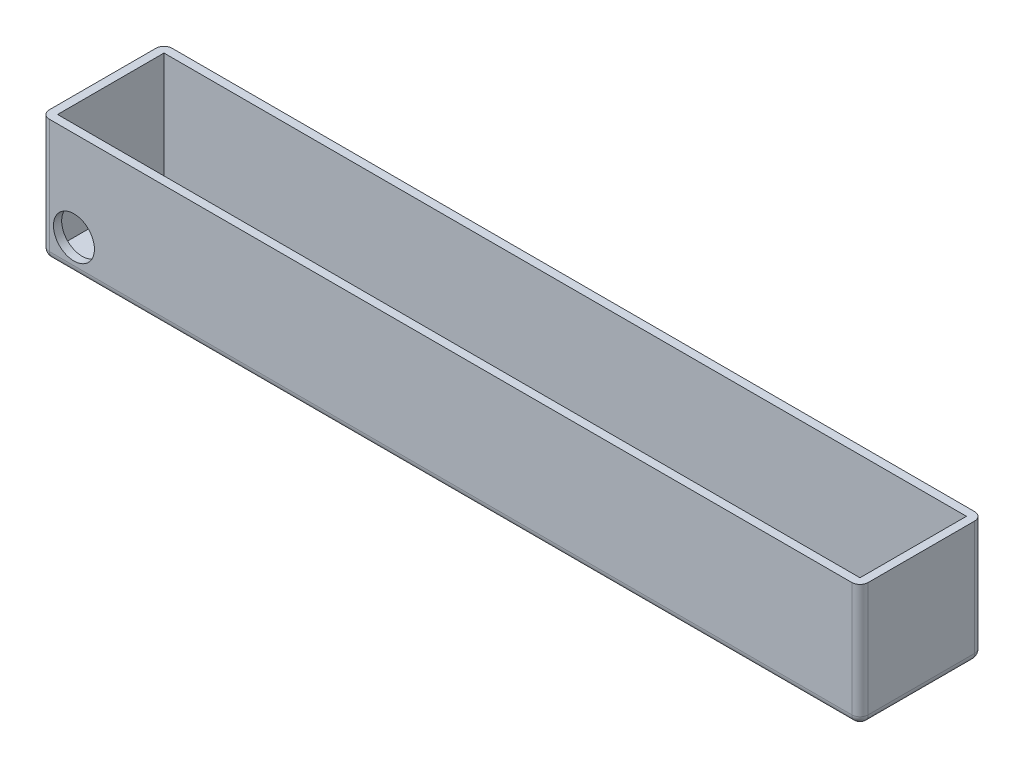
ISO-10303-21;
HEADER;
FILE_DESCRIPTION(('STEP AP214'),'2;1');
FILE_NAME('part.step','',(''),(''),'','','');
FILE_SCHEMA(('AUTOMOTIVE_DESIGN { 1 0 10303 214 1 1 1 1 }'));
ENDSEC;
DATA;
#1=APPLICATION_CONTEXT('core data for automotive mechanical design processes');
#2=APPLICATION_PROTOCOL_DEFINITION('international standard','automotive_design',2000,#1);
#3=PRODUCT_CONTEXT('',#1,'mechanical');
#4=PRODUCT('Part','Part','',(#3));
#5=PRODUCT_RELATED_PRODUCT_CATEGORY('part','',(#4));
#6=PRODUCT_DEFINITION_FORMATION('','',#4);
#7=PRODUCT_DEFINITION_CONTEXT('part definition',#1,'design');
#8=PRODUCT_DEFINITION('design','',#6,#7);
#9=PRODUCT_DEFINITION_SHAPE('','',#8);
#10=(LENGTH_UNIT() NAMED_UNIT(*) SI_UNIT(.MILLI.,.METRE.));
#11=(NAMED_UNIT(*) PLANE_ANGLE_UNIT() SI_UNIT($,.RADIAN.));
#12=(NAMED_UNIT(*) SI_UNIT($,.STERADIAN.) SOLID_ANGLE_UNIT());
#13=UNCERTAINTY_MEASURE_WITH_UNIT(LENGTH_MEASURE(1.E-05),#10,'distance_accuracy_value','');
#14=(GEOMETRIC_REPRESENTATION_CONTEXT(3) GLOBAL_UNCERTAINTY_ASSIGNED_CONTEXT((#13)) GLOBAL_UNIT_ASSIGNED_CONTEXT((#10,
#11,#12)) REPRESENTATION_CONTEXT('',''));
#15=CARTESIAN_POINT('',(0.,0.,0.));
#16=DIRECTION('',(0.,0.,1.));
#17=DIRECTION('',(1.,0.,0.));
#18=AXIS2_PLACEMENT_3D('',#15,#16,#17);
#19=CARTESIAN_POINT('',(124.46,0.,19.05));
#20=DIRECTION('',(0.,0.,-1.));
#21=DIRECTION('',(-1.,0.,0.));
#22=AXIS2_PLACEMENT_3D('',#19,#20,#21);
#23=PLANE('',#22);
#24=CARTESIAN_POINT('',(-116.84,10.16,19.05));
#25=DIRECTION('',(0.,0.,-1.));
#26=DIRECTION('',(-1.,0.,0.));
#27=AXIS2_PLACEMENT_3D('',#24,#25,#26);
#28=CIRCLE('',#27,6.35);
#29=CARTESIAN_POINT('',(-110.49,10.16,19.05));
#30=VERTEX_POINT('',#29);
#31=EDGE_CURVE('E310',#30,#30,#28,.T.);
#32=ORIENTED_EDGE('',*,*,#31,.T.);
#33=EDGE_LOOP('',(#32));
#34=FACE_BOUND('',#33,.T.);
#35=DIRECTION('',(-1.,0.,0.));
#36=VECTOR('',#35,1.);
#37=CARTESIAN_POINT('',(124.46,2.54,19.05));
#38=LINE('',#37,#36);
#39=CARTESIAN_POINT('',(124.46,2.54,19.05));
#40=VERTEX_POINT('',#39);
#41=CARTESIAN_POINT('',(-124.46,2.54,19.05));
#42=VERTEX_POINT('',#41);
#43=EDGE_CURVE('E254',#40,#42,#38,.T.);
#44=ORIENTED_EDGE('',*,*,#43,.F.);
#45=DIRECTION('',(0.,1.,0.));
#46=VECTOR('',#45,1.);
#47=CARTESIAN_POINT('',(124.46,38.1,19.05));
#48=LINE('',#47,#46);
#49=CARTESIAN_POINT('',(124.46,38.1,19.05));
#50=VERTEX_POINT('',#49);
#51=EDGE_CURVE('E332',#40,#50,#48,.T.);
#52=ORIENTED_EDGE('',*,*,#51,.T.);
#53=DIRECTION('',(-1.,0.,0.));
#54=VECTOR('',#53,1.);
#55=CARTESIAN_POINT('',(124.46,38.1,19.05));
#56=LINE('',#55,#54);
#57=CARTESIAN_POINT('',(-124.46,38.1,19.05));
#58=VERTEX_POINT('',#57);
#59=EDGE_CURVE('E197',#50,#58,#56,.T.);
#60=ORIENTED_EDGE('',*,*,#59,.T.);
#61=DIRECTION('',(0.,-1.,0.));
#62=VECTOR('',#61,1.);
#63=CARTESIAN_POINT('',(-124.46,0.,19.05));
#64=LINE('',#63,#62);
#65=EDGE_CURVE('E257',#58,#42,#64,.T.);
#66=ORIENTED_EDGE('',*,*,#65,.T.);
#67=EDGE_LOOP('',(#44,#52,#60,#66));
#68=FACE_BOUND('',#67,.T.);
#69=ADVANCED_FACE('F45',(#34,#68),#23,.F.);
#70=CARTESIAN_POINT('',(124.46,2.54,16.51));
#71=DIRECTION('',(-1.,0.,0.));
#72=DIRECTION('',(0.,0.,1.));
#73=AXIS2_PLACEMENT_3D('',#70,#71,#72);
#74=CYLINDRICAL_SURFACE('',#73,2.54);
#75=DIRECTION('',(-1.,0.,0.));
#76=VECTOR('',#75,1.);
#77=CARTESIAN_POINT('',(124.46,0.,16.51));
#78=LINE('',#77,#76);
#79=CARTESIAN_POINT('',(124.46,0.,16.51));
#80=VERTEX_POINT('',#79);
#81=CARTESIAN_POINT('',(-124.46,0.,16.51));
#82=VERTEX_POINT('',#81);
#83=EDGE_CURVE('E251',#80,#82,#78,.T.);
#84=ORIENTED_EDGE('',*,*,#83,.F.);
#85=CARTESIAN_POINT('',(124.46,2.54,16.51));
#86=DIRECTION('',(-1.,0.,0.));
#87=DIRECTION('',(0.,0.,1.));
#88=AXIS2_PLACEMENT_3D('',#85,#86,#87);
#89=CIRCLE('',#88,2.54);
#90=EDGE_CURVE('E55',#80,#40,#89,.T.);
#91=ORIENTED_EDGE('',*,*,#90,.T.);
#92=ORIENTED_EDGE('',*,*,#43,.T.);
#93=CARTESIAN_POINT('',(-124.46,2.54,16.51));
#94=DIRECTION('',(-1.,0.,0.));
#95=DIRECTION('',(0.,0.,1.));
#96=AXIS2_PLACEMENT_3D('',#93,#94,#95);
#97=CIRCLE('',#96,2.54);
#98=EDGE_CURVE('E277',#42,#82,#97,.F.);
#99=ORIENTED_EDGE('',*,*,#98,.T.);
#100=EDGE_LOOP('',(#84,#91,#92,#99));
#101=FACE_BOUND('',#100,.T.);
#102=ADVANCED_FACE('F376',(#101),#74,.T.);
#103=CARTESIAN_POINT('',(124.46,0.,0.));
#104=DIRECTION('',(0.,1.,0.));
#105=DIRECTION('',(0.,0.,1.));
#106=AXIS2_PLACEMENT_3D('',#103,#104,#105);
#107=PLANE('',#106);
#108=DIRECTION('',(-1.,0.,0.));
#109=VECTOR('',#108,1.);
#110=CARTESIAN_POINT('',(124.46,0.,-16.51));
#111=LINE('',#110,#109);
#112=CARTESIAN_POINT('',(124.46,0.,-16.51));
#113=VERTEX_POINT('',#112);
#114=CARTESIAN_POINT('',(-124.46,0.,-16.51));
#115=VERTEX_POINT('',#114);
#116=EDGE_CURVE('E248',#113,#115,#111,.T.);
#117=ORIENTED_EDGE('',*,*,#116,.F.);
#118=DIRECTION('',(0.,0.,1.));
#119=VECTOR('',#118,1.);
#120=CARTESIAN_POINT('',(124.46,0.,16.51));
#121=LINE('',#120,#119);
#122=EDGE_CURVE('E11',#113,#80,#121,.T.);
#123=ORIENTED_EDGE('',*,*,#122,.T.);
#124=ORIENTED_EDGE('',*,*,#83,.T.);
#125=DIRECTION('',(0.,0.,-1.));
#126=VECTOR('',#125,1.);
#127=CARTESIAN_POINT('',(-124.46,0.,0.));
#128=LINE('',#127,#126);
#129=EDGE_CURVE('E289',#82,#115,#128,.T.);
#130=ORIENTED_EDGE('',*,*,#129,.T.);
#131=EDGE_LOOP('',(#117,#123,#124,#130));
#132=FACE_BOUND('',#131,.T.);
#133=ADVANCED_FACE('F382',(#132),#107,.F.);
#134=CARTESIAN_POINT('',(124.46,2.54,-16.51));
#135=DIRECTION('',(-1.,0.,0.));
#136=DIRECTION('',(0.,0.,1.));
#137=AXIS2_PLACEMENT_3D('',#134,#135,#136);
#138=CYLINDRICAL_SURFACE('',#137,2.54);
#139=DIRECTION('',(-1.,0.,0.));
#140=VECTOR('',#139,1.);
#141=CARTESIAN_POINT('',(124.46,2.54,-19.05));
#142=LINE('',#141,#140);
#143=CARTESIAN_POINT('',(124.46,2.54,-19.05));
#144=VERTEX_POINT('',#143);
#145=CARTESIAN_POINT('',(-124.46,2.54,-19.05));
#146=VERTEX_POINT('',#145);
#147=EDGE_CURVE('E245',#144,#146,#142,.T.);
#148=ORIENTED_EDGE('',*,*,#147,.F.);
#149=CARTESIAN_POINT('',(124.46,2.54,-16.51));
#150=DIRECTION('',(-1.,0.,0.));
#151=DIRECTION('',(0.,0.,1.));
#152=AXIS2_PLACEMENT_3D('',#149,#150,#151);
#153=CIRCLE('',#152,2.54);
#154=EDGE_CURVE('E329',#144,#113,#153,.T.);
#155=ORIENTED_EDGE('',*,*,#154,.T.);
#156=ORIENTED_EDGE('',*,*,#116,.T.);
#157=CARTESIAN_POINT('',(-124.46,2.54,-16.51));
#158=DIRECTION('',(-1.,0.,0.));
#159=DIRECTION('',(0.,0.,1.));
#160=AXIS2_PLACEMENT_3D('',#157,#158,#159);
#161=CIRCLE('',#160,2.54);
#162=EDGE_CURVE('E285',#115,#146,#161,.F.);
#163=ORIENTED_EDGE('',*,*,#162,.T.);
#164=EDGE_LOOP('',(#148,#155,#156,#163));
#165=FACE_BOUND('',#164,.T.);
#166=ADVANCED_FACE('F389',(#165),#138,.T.);
#167=CARTESIAN_POINT('',(124.46,0.,-19.05));
#168=DIRECTION('',(0.,0.,-1.));
#169=DIRECTION('',(0.,1.,0.));
#170=AXIS2_PLACEMENT_3D('',#167,#168,#169);
#171=PLANE('',#170);
#172=DIRECTION('',(-1.,0.,0.));
#173=VECTOR('',#172,1.);
#174=CARTESIAN_POINT('',(124.46,38.1,-19.05));
#175=LINE('',#174,#173);
#176=CARTESIAN_POINT('',(124.46,38.1,-19.05));
#177=VERTEX_POINT('',#176);
#178=CARTESIAN_POINT('',(-124.46,38.1,-19.05));
#179=VERTEX_POINT('',#178);
#180=EDGE_CURVE('E242',#177,#179,#175,.T.);
#181=ORIENTED_EDGE('',*,*,#180,.F.);
#182=DIRECTION('',(0.,1.,0.));
#183=VECTOR('',#182,1.);
#184=CARTESIAN_POINT('',(124.46,0.,-19.05));
#185=LINE('',#184,#183);
#186=EDGE_CURVE('E326',#177,#144,#185,.F.);
#187=ORIENTED_EDGE('',*,*,#186,.T.);
#188=ORIENTED_EDGE('',*,*,#147,.T.);
#189=DIRECTION('',(0.,-1.,0.));
#190=VECTOR('',#189,1.);
#191=CARTESIAN_POINT('',(-124.46,38.1,-19.05));
#192=LINE('',#191,#190);
#193=EDGE_CURVE('E281',#146,#179,#192,.F.);
#194=ORIENTED_EDGE('',*,*,#193,.T.);
#195=EDGE_LOOP('',(#181,#187,#188,#194));
#196=FACE_BOUND('',#195,.T.);
#197=ADVANCED_FACE('F397',(#196),#171,.T.);
#198=CARTESIAN_POINT('',(124.46,0.,-16.51));
#199=DIRECTION('',(0.,0.,-1.));
#200=DIRECTION('',(0.,1.,0.));
#201=AXIS2_PLACEMENT_3D('',#198,#199,#200);
#202=PLANE('',#201);
#203=DIRECTION('',(0.,-1.,0.));
#204=VECTOR('',#203,1.);
#205=CARTESIAN_POINT('',(-124.46,0.,-16.51));
#206=LINE('',#205,#204);
#207=CARTESIAN_POINT('',(-124.46,38.1,-16.51));
#208=VERTEX_POINT('',#207);
#209=CARTESIAN_POINT('',(-124.46,2.54,-16.51));
#210=VERTEX_POINT('',#209);
#211=EDGE_CURVE('E179',#208,#210,#206,.T.);
#212=ORIENTED_EDGE('',*,*,#211,.T.);
#213=DIRECTION('',(-1.,0.,0.));
#214=VECTOR('',#213,1.);
#215=CARTESIAN_POINT('',(124.46,2.54,-16.51));
#216=LINE('',#215,#214);
#217=CARTESIAN_POINT('',(124.46,2.54,-16.51));
#218=VERTEX_POINT('',#217);
#219=EDGE_CURVE('E235',#218,#210,#216,.T.);
#220=ORIENTED_EDGE('',*,*,#219,.F.);
#221=DIRECTION('',(0.,-1.,0.));
#222=VECTOR('',#221,1.);
#223=CARTESIAN_POINT('',(124.46,0.,-16.51));
#224=LINE('',#223,#222);
#225=CARTESIAN_POINT('',(124.46,38.1,-16.51));
#226=VERTEX_POINT('',#225);
#227=EDGE_CURVE('E203',#226,#218,#224,.T.);
#228=ORIENTED_EDGE('',*,*,#227,.F.);
#229=DIRECTION('',(-1.,0.,0.));
#230=VECTOR('',#229,1.);
#231=CARTESIAN_POINT('',(124.46,38.1,-16.51));
#232=LINE('',#231,#230);
#233=EDGE_CURVE('E239',#226,#208,#232,.T.);
#234=ORIENTED_EDGE('',*,*,#233,.T.);
#235=EDGE_LOOP('',(#212,#220,#228,#234));
#236=FACE_BOUND('',#235,.T.);
#237=ADVANCED_FACE('F467',(#236),#202,.F.);
#238=CARTESIAN_POINT('',(124.46,2.54,0.));
#239=DIRECTION('',(0.,-1.,0.));
#240=DIRECTION('',(0.,0.,-1.));
#241=AXIS2_PLACEMENT_3D('',#238,#239,#240);
#242=PLANE('',#241);
#243=DIRECTION('',(0.,0.,1.));
#244=VECTOR('',#243,1.);
#245=CARTESIAN_POINT('',(-124.46,2.54,0.));
#246=LINE('',#245,#244);
#247=CARTESIAN_POINT('',(-124.46,2.54,-6.35));
#248=VERTEX_POINT('',#247);
#249=EDGE_CURVE('E414',#210,#248,#246,.T.);
#250=ORIENTED_EDGE('',*,*,#249,.T.);
#251=DIRECTION('',(-1.,0.,0.));
#252=VECTOR('',#251,1.);
#253=CARTESIAN_POINT('',(124.46,2.54,-6.35));
#254=LINE('',#253,#252);
#255=CARTESIAN_POINT('',(124.46,2.54,-6.35));
#256=VERTEX_POINT('',#255);
#257=EDGE_CURVE('E231',#256,#248,#254,.T.);
#258=ORIENTED_EDGE('',*,*,#257,.F.);
#259=DIRECTION('',(0.,0.,1.));
#260=VECTOR('',#259,1.);
#261=CARTESIAN_POINT('',(124.46,2.54,0.));
#262=LINE('',#261,#260);
#263=EDGE_CURVE('E208',#218,#256,#262,.T.);
#264=ORIENTED_EDGE('',*,*,#263,.F.);
#265=ORIENTED_EDGE('',*,*,#219,.T.);
#266=EDGE_LOOP('',(#250,#258,#264,#265));
#267=FACE_BOUND('',#266,.T.);
#268=ADVANCED_FACE('F462',(#267),#242,.F.);
#269=CARTESIAN_POINT('',(124.46,0.,-6.35));
#270=DIRECTION('',(0.,0.,-1.));
#271=DIRECTION('',(0.,1.,0.));
#272=AXIS2_PLACEMENT_3D('',#269,#270,#271);
#273=PLANE('',#272);
#274=DIRECTION('',(0.,-1.,0.));
#275=VECTOR('',#274,1.);
#276=CARTESIAN_POINT('',(-124.46,0.,-6.35));
#277=LINE('',#276,#275);
#278=CARTESIAN_POINT('',(-124.46,1.016,-6.35));
#279=VERTEX_POINT('',#278);
#280=EDGE_CURVE('E441',#248,#279,#277,.T.);
#281=ORIENTED_EDGE('',*,*,#280,.T.);
#282=DIRECTION('',(-1.,0.,0.));
#283=VECTOR('',#282,1.);
#284=CARTESIAN_POINT('',(124.46,1.016,-6.35));
#285=LINE('',#284,#283);
#286=CARTESIAN_POINT('',(124.46,1.016,-6.35));
#287=VERTEX_POINT('',#286);
#288=EDGE_CURVE('E227',#287,#279,#285,.T.);
#289=ORIENTED_EDGE('',*,*,#288,.F.);
#290=DIRECTION('',(0.,-1.,0.));
#291=VECTOR('',#290,1.);
#292=CARTESIAN_POINT('',(124.46,0.,-6.35));
#293=LINE('',#292,#291);
#294=EDGE_CURVE('E421',#256,#287,#293,.T.);
#295=ORIENTED_EDGE('',*,*,#294,.F.);
#296=ORIENTED_EDGE('',*,*,#257,.T.);
#297=EDGE_LOOP('',(#281,#289,#295,#296));
#298=FACE_BOUND('',#297,.T.);
#299=ADVANCED_FACE('F459',(#298),#273,.F.);
#300=CARTESIAN_POINT('',(124.46,1.016,0.));
#301=DIRECTION('',(0.,1.,0.));
#302=DIRECTION('',(0.,0.,1.));
#303=AXIS2_PLACEMENT_3D('',#300,#301,#302);
#304=PLANE('',#303);
#305=DIRECTION('',(0.,0.,-1.));
#306=VECTOR('',#305,1.);
#307=CARTESIAN_POINT('',(-124.46,1.016,0.));
#308=LINE('',#307,#306);
#309=CARTESIAN_POINT('',(-124.46,1.016,6.35));
#310=VERTEX_POINT('',#309);
#311=EDGE_CURVE('E445',#310,#279,#308,.T.);
#312=ORIENTED_EDGE('',*,*,#311,.F.);
#313=DIRECTION('',(-1.,0.,0.));
#314=VECTOR('',#313,1.);
#315=CARTESIAN_POINT('',(124.46,1.016,6.35));
#316=LINE('',#315,#314);
#317=CARTESIAN_POINT('',(124.46,1.016,6.35));
#318=VERTEX_POINT('',#317);
#319=EDGE_CURVE('E223',#318,#310,#316,.T.);
#320=ORIENTED_EDGE('',*,*,#319,.F.);
#321=DIRECTION('',(0.,0.,-1.));
#322=VECTOR('',#321,1.);
#323=CARTESIAN_POINT('',(124.46,1.016,0.));
#324=LINE('',#323,#322);
#325=EDGE_CURVE('E424',#318,#287,#324,.T.);
#326=ORIENTED_EDGE('',*,*,#325,.T.);
#327=ORIENTED_EDGE('',*,*,#288,.T.);
#328=EDGE_LOOP('',(#312,#320,#326,#327));
#329=FACE_BOUND('',#328,.T.);
#330=ADVANCED_FACE('F455',(#329),#304,.T.);
#331=CARTESIAN_POINT('',(124.46,0.,6.35));
#332=DIRECTION('',(0.,0.,-1.));
#333=DIRECTION('',(-1.,0.,0.));
#334=AXIS2_PLACEMENT_3D('',#331,#332,#333);
#335=PLANE('',#334);
#336=DIRECTION('',(0.,-1.,0.));
#337=VECTOR('',#336,1.);
#338=CARTESIAN_POINT('',(-124.46,0.,6.35));
#339=LINE('',#338,#337);
#340=CARTESIAN_POINT('',(-124.46,2.54,6.35));
#341=VERTEX_POINT('',#340);
#342=EDGE_CURVE('E210',#341,#310,#339,.T.);
#343=ORIENTED_EDGE('',*,*,#342,.F.);
#344=DIRECTION('',(-1.,0.,0.));
#345=VECTOR('',#344,1.);
#346=CARTESIAN_POINT('',(124.46,2.54,6.35));
#347=LINE('',#346,#345);
#348=CARTESIAN_POINT('',(124.46,2.54,6.35));
#349=VERTEX_POINT('',#348);
#350=EDGE_CURVE('E219',#349,#341,#347,.T.);
#351=ORIENTED_EDGE('',*,*,#350,.F.);
#352=DIRECTION('',(0.,-1.,0.));
#353=VECTOR('',#352,1.);
#354=CARTESIAN_POINT('',(124.46,0.,6.35));
#355=LINE('',#354,#353);
#356=EDGE_CURVE('E428',#349,#318,#355,.T.);
#357=ORIENTED_EDGE('',*,*,#356,.T.);
#358=ORIENTED_EDGE('',*,*,#319,.T.);
#359=EDGE_LOOP('',(#343,#351,#357,#358));
#360=FACE_BOUND('',#359,.T.);
#361=ADVANCED_FACE('F453',(#360),#335,.T.);
#362=CARTESIAN_POINT('',(124.46,2.54,0.));
#363=DIRECTION('',(0.,1.,0.));
#364=DIRECTION('',(0.,0.,1.));
#365=AXIS2_PLACEMENT_3D('',#362,#363,#364);
#366=PLANE('',#365);
#367=DIRECTION('',(0.,0.,-1.));
#368=VECTOR('',#367,1.);
#369=CARTESIAN_POINT('',(-124.46,2.54,0.));
#370=LINE('',#369,#368);
#371=CARTESIAN_POINT('',(-124.46,2.54,16.51));
#372=VERTEX_POINT('',#371);
#373=EDGE_CURVE('E204',#372,#341,#370,.T.);
#374=ORIENTED_EDGE('',*,*,#373,.F.);
#375=DIRECTION('',(-1.,0.,0.));
#376=VECTOR('',#375,1.);
#377=CARTESIAN_POINT('',(124.46,2.54,16.51));
#378=LINE('',#377,#376);
#379=CARTESIAN_POINT('',(124.46,2.54,16.51));
#380=VERTEX_POINT('',#379);
#381=EDGE_CURVE('E196',#380,#372,#378,.T.);
#382=ORIENTED_EDGE('',*,*,#381,.F.);
#383=DIRECTION('',(0.,0.,-1.));
#384=VECTOR('',#383,1.);
#385=CARTESIAN_POINT('',(124.46,2.54,0.));
#386=LINE('',#385,#384);
#387=EDGE_CURVE('E432',#380,#349,#386,.T.);
#388=ORIENTED_EDGE('',*,*,#387,.T.);
#389=ORIENTED_EDGE('',*,*,#350,.T.);
#390=EDGE_LOOP('',(#374,#382,#388,#389));
#391=FACE_BOUND('',#390,.T.);
#392=ADVANCED_FACE('F471',(#391),#366,.T.);
#393=CARTESIAN_POINT('',(124.46,0.,16.51));
#394=DIRECTION('',(0.,0.,-1.));
#395=DIRECTION('',(0.,1.,0.));
#396=AXIS2_PLACEMENT_3D('',#393,#394,#395);
#397=PLANE('',#396);
#398=CARTESIAN_POINT('',(-116.84,10.16,16.51));
#399=DIRECTION('',(0.,0.,-1.));
#400=DIRECTION('',(0.,1.,0.));
#401=AXIS2_PLACEMENT_3D('',#398,#399,#400);
#402=CIRCLE('',#401,6.35);
#403=CARTESIAN_POINT('',(-110.49,10.16,16.51));
#404=VERTEX_POINT('',#403);
#405=EDGE_CURVE('E185',#404,#404,#402,.T.);
#406=ORIENTED_EDGE('',*,*,#405,.F.);
#407=EDGE_LOOP('',(#406));
#408=FACE_BOUND('',#407,.T.);
#409=DIRECTION('',(0.,-1.,0.));
#410=VECTOR('',#409,1.);
#411=CARTESIAN_POINT('',(-124.46,0.,16.51));
#412=LINE('',#411,#410);
#413=CARTESIAN_POINT('',(-124.46,38.1,16.51));
#414=VERTEX_POINT('',#413);
#415=EDGE_CURVE('E176',#414,#372,#412,.T.);
#416=ORIENTED_EDGE('',*,*,#415,.F.);
#417=DIRECTION('',(-1.,0.,0.));
#418=VECTOR('',#417,1.);
#419=CARTESIAN_POINT('',(124.46,38.1,16.51));
#420=LINE('',#419,#418);
#421=CARTESIAN_POINT('',(124.46,38.1,16.51));
#422=VERTEX_POINT('',#421);
#423=EDGE_CURVE('E189',#422,#414,#420,.T.);
#424=ORIENTED_EDGE('',*,*,#423,.F.);
#425=DIRECTION('',(0.,-1.,0.));
#426=VECTOR('',#425,1.);
#427=CARTESIAN_POINT('',(124.46,0.,16.51));
#428=LINE('',#427,#426);
#429=EDGE_CURVE('E215',#422,#380,#428,.T.);
#430=ORIENTED_EDGE('',*,*,#429,.T.);
#431=ORIENTED_EDGE('',*,*,#381,.T.);
#432=EDGE_LOOP('',(#416,#424,#430,#431));
#433=FACE_BOUND('',#432,.T.);
#434=ADVANCED_FACE('F199',(#408,#433),#397,.T.);
#435=CARTESIAN_POINT('',(124.46,38.1,0.));
#436=DIRECTION('',(0.,1.,0.));
#437=DIRECTION('',(0.,0.,1.));
#438=AXIS2_PLACEMENT_3D('',#435,#436,#437);
#439=PLANE('',#438);
#440=ORIENTED_EDGE('',*,*,#423,.T.);
#441=DIRECTION('',(0.,0.,-1.));
#442=VECTOR('',#441,1.);
#443=CARTESIAN_POINT('',(-124.46,38.1,0.));
#444=LINE('',#443,#442);
#445=EDGE_CURVE('E172',#414,#208,#444,.T.);
#446=ORIENTED_EDGE('',*,*,#445,.T.);
#447=ORIENTED_EDGE('',*,*,#233,.F.);
#448=DIRECTION('',(0.,0.,1.));
#449=VECTOR('',#448,1.);
#450=CARTESIAN_POINT('',(124.46,38.1,0.));
#451=LINE('',#450,#449);
#452=EDGE_CURVE('E192',#226,#422,#451,.T.);
#453=ORIENTED_EDGE('',*,*,#452,.T.);
#454=EDGE_LOOP('',(#440,#446,#447,#453));
#455=FACE_BOUND('',#454,.T.);
#456=DIRECTION('',(0.,0.,1.));
#457=VECTOR('',#456,1.);
#458=CARTESIAN_POINT('',(127.,38.1,0.));
#459=LINE('',#458,#457);
#460=CARTESIAN_POINT('',(127.,38.1,-16.51));
#461=VERTEX_POINT('',#460);
#462=CARTESIAN_POINT('',(127.,38.1,16.51));
#463=VERTEX_POINT('',#462);
#464=EDGE_CURVE('E409',#461,#463,#459,.T.);
#465=ORIENTED_EDGE('',*,*,#464,.F.);
#466=CARTESIAN_POINT('',(124.46,38.1,-16.51));
#467=DIRECTION('',(0.,1.,0.));
#468=DIRECTION('',(0.,0.,1.));
#469=AXIS2_PLACEMENT_3D('',#466,#467,#468);
#470=CIRCLE('',#469,2.54);
#471=EDGE_CURVE('E323',#461,#177,#470,.T.);
#472=ORIENTED_EDGE('',*,*,#471,.T.);
#473=ORIENTED_EDGE('',*,*,#180,.T.);
#474=CARTESIAN_POINT('',(-124.46,38.1,-16.51));
#475=DIRECTION('',(0.,1.,0.));
#476=DIRECTION('',(0.,0.,1.));
#477=AXIS2_PLACEMENT_3D('',#474,#475,#476);
#478=CIRCLE('',#477,2.54);
#479=CARTESIAN_POINT('',(-127.,38.1,-16.51));
#480=VERTEX_POINT('',#479);
#481=EDGE_CURVE('E270',#179,#480,#478,.T.);
#482=ORIENTED_EDGE('',*,*,#481,.T.);
#483=DIRECTION('',(0.,0.,-1.));
#484=VECTOR('',#483,1.);
#485=CARTESIAN_POINT('',(-127.,38.1,0.));
#486=LINE('',#485,#484);
#487=CARTESIAN_POINT('',(-127.,38.1,16.51));
#488=VERTEX_POINT('',#487);
#489=EDGE_CURVE('E184',#488,#480,#486,.T.);
#490=ORIENTED_EDGE('',*,*,#489,.F.);
#491=CARTESIAN_POINT('',(-124.46,38.1,16.51));
#492=DIRECTION('',(0.,1.,0.));
#493=DIRECTION('',(0.,0.,1.));
#494=AXIS2_PLACEMENT_3D('',#491,#492,#493);
#495=CIRCLE('',#494,2.54);
#496=EDGE_CURVE('E273',#488,#58,#495,.T.);
#497=ORIENTED_EDGE('',*,*,#496,.T.);
#498=ORIENTED_EDGE('',*,*,#59,.F.);
#499=CARTESIAN_POINT('',(124.46,38.1,16.51));
#500=DIRECTION('',(0.,1.,0.));
#501=DIRECTION('',(0.,0.,1.));
#502=AXIS2_PLACEMENT_3D('',#499,#500,#501);
#503=CIRCLE('',#502,2.54);
#504=EDGE_CURVE('E320',#50,#463,#503,.T.);
#505=ORIENTED_EDGE('',*,*,#504,.T.);
#506=EDGE_LOOP('',(#465,#472,#473,#482,#490,#497,#498,#505));
#507=FACE_BOUND('',#506,.T.);
#508=ADVANCED_FACE('F190',(#455,#507),#439,.T.);
#509=CARTESIAN_POINT('',(124.46,2.54,16.51));
#510=DIRECTION('',(1.,0.,0.));
#511=DIRECTION('',(0.,0.,-1.));
#512=AXIS2_PLACEMENT_3D('',#509,#510,#511);
#513=PLANE('',#512);
#514=ORIENTED_EDGE('',*,*,#452,.F.);
#515=ORIENTED_EDGE('',*,*,#227,.T.);
#516=ORIENTED_EDGE('',*,*,#263,.T.);
#517=ORIENTED_EDGE('',*,*,#294,.T.);
#518=ORIENTED_EDGE('',*,*,#325,.F.);
#519=ORIENTED_EDGE('',*,*,#356,.F.);
#520=ORIENTED_EDGE('',*,*,#387,.F.);
#521=ORIENTED_EDGE('',*,*,#429,.F.);
#522=EDGE_LOOP('',(#514,#515,#516,#517,#518,#519,#520,#521));
#523=FACE_BOUND('',#522,.T.);
#524=ADVANCED_FACE('F469',(#523),#513,.F.);
#525=CARTESIAN_POINT('',(127.,2.54,16.51));
#526=DIRECTION('',(1.,0.,0.));
#527=DIRECTION('',(0.,0.,-1.));
#528=AXIS2_PLACEMENT_3D('',#525,#526,#527);
#529=PLANE('',#528);
#530=DIRECTION('',(0.,0.,1.));
#531=VECTOR('',#530,1.);
#532=CARTESIAN_POINT('',(127.,2.54,-16.51));
#533=LINE('',#532,#531);
#534=CARTESIAN_POINT('',(127.,2.54,16.51));
#535=VERTEX_POINT('',#534);
#536=CARTESIAN_POINT('',(127.,2.54,-16.51));
#537=VERTEX_POINT('',#536);
#538=EDGE_CURVE('E293',#535,#537,#533,.F.);
#539=ORIENTED_EDGE('',*,*,#538,.T.);
#540=DIRECTION('',(0.,1.,0.));
#541=VECTOR('',#540,1.);
#542=CARTESIAN_POINT('',(127.,2.54000000000001,-16.51));
#543=LINE('',#542,#541);
#544=EDGE_CURVE('E316',#537,#461,#543,.T.);
#545=ORIENTED_EDGE('',*,*,#544,.T.);
#546=ORIENTED_EDGE('',*,*,#464,.T.);
#547=DIRECTION('',(0.,1.,0.));
#548=VECTOR('',#547,1.);
#549=CARTESIAN_POINT('',(127.,2.54,16.51));
#550=LINE('',#549,#548);
#551=EDGE_CURVE('E313',#463,#535,#550,.F.);
#552=ORIENTED_EDGE('',*,*,#551,.T.);
#553=EDGE_LOOP('',(#539,#545,#546,#552));
#554=FACE_BOUND('',#553,.T.);
#555=ADVANCED_FACE('F408',(#554),#529,.T.);
#556=CARTESIAN_POINT('',(-127.,2.54,-16.51));
#557=DIRECTION('',(1.,0.,0.));
#558=DIRECTION('',(0.,0.,-1.));
#559=AXIS2_PLACEMENT_3D('',#556,#557,#558);
#560=PLANE('',#559);
#561=DIRECTION('',(0.,0.,-1.));
#562=VECTOR('',#561,1.);
#563=CARTESIAN_POINT('',(-127.,2.54,-16.51));
#564=LINE('',#563,#562);
#565=CARTESIAN_POINT('',(-127.,2.54,-16.51));
#566=VERTEX_POINT('',#565);
#567=CARTESIAN_POINT('',(-127.,2.54,16.51));
#568=VERTEX_POINT('',#567);
#569=EDGE_CURVE('E261',#566,#568,#564,.F.);
#570=ORIENTED_EDGE('',*,*,#569,.T.);
#571=DIRECTION('',(0.,-1.,0.));
#572=VECTOR('',#571,1.);
#573=CARTESIAN_POINT('',(-127.,2.54,16.51));
#574=LINE('',#573,#572);
#575=EDGE_CURVE('E267',#568,#488,#574,.F.);
#576=ORIENTED_EDGE('',*,*,#575,.T.);
#577=ORIENTED_EDGE('',*,*,#489,.T.);
#578=DIRECTION('',(0.,-1.,0.));
#579=VECTOR('',#578,1.);
#580=CARTESIAN_POINT('',(-127.,2.54000000000001,-16.51));
#581=LINE('',#580,#579);
#582=EDGE_CURVE('E264',#480,#566,#581,.T.);
#583=ORIENTED_EDGE('',*,*,#582,.T.);
#584=EDGE_LOOP('',(#570,#576,#577,#583));
#585=FACE_BOUND('',#584,.T.);
#586=ADVANCED_FACE('F550',(#585),#560,.F.);
#587=CARTESIAN_POINT('',(-124.46,2.54,-16.51));
#588=DIRECTION('',(1.,0.,0.));
#589=DIRECTION('',(0.,0.,-1.));
#590=AXIS2_PLACEMENT_3D('',#587,#588,#589);
#591=PLANE('',#590);
#592=ORIENTED_EDGE('',*,*,#445,.F.);
#593=ORIENTED_EDGE('',*,*,#415,.T.);
#594=ORIENTED_EDGE('',*,*,#373,.T.);
#595=ORIENTED_EDGE('',*,*,#342,.T.);
#596=ORIENTED_EDGE('',*,*,#311,.T.);
#597=ORIENTED_EDGE('',*,*,#280,.F.);
#598=ORIENTED_EDGE('',*,*,#249,.F.);
#599=ORIENTED_EDGE('',*,*,#211,.F.);
#600=EDGE_LOOP('',(#592,#593,#594,#595,#596,#597,#598,#599));
#601=FACE_BOUND('',#600,.T.);
#602=ADVANCED_FACE('F174',(#601),#591,.T.);
#603=CARTESIAN_POINT('',(-116.84,10.16,-1.45051224213829));
#604=DIRECTION('',(0.,0.,1.));
#605=DIRECTION('',(1.,0.,0.));
#606=AXIS2_PLACEMENT_3D('',#603,#604,#605);
#607=CYLINDRICAL_SURFACE('',#606,6.35);
#608=CARTESIAN_POINT('',(-110.49,10.16,19.05));
#609=CARTESIAN_POINT('',(-110.49,10.16,19.0235416666667));
#610=CARTESIAN_POINT('',(-110.49,10.16,18.9970833333333));
#611=CARTESIAN_POINT('',(-110.49,10.16,18.9441666666667));
#612=CARTESIAN_POINT('',(-110.49,10.16,18.9177083333333));
#613=CARTESIAN_POINT('',(-110.49,10.16,18.8647916666667));
#614=CARTESIAN_POINT('',(-110.49,10.16,18.8383333333333));
#615=CARTESIAN_POINT('',(-110.49,10.16,18.7854166666667));
#616=CARTESIAN_POINT('',(-110.49,10.16,18.7589583333333));
#617=CARTESIAN_POINT('',(-110.49,10.16,18.7060416666667));
#618=CARTESIAN_POINT('',(-110.49,10.16,18.6795833333333));
#619=CARTESIAN_POINT('',(-110.49,10.16,18.6266666666667));
#620=CARTESIAN_POINT('',(-110.49,10.16,18.6002083333333));
#621=CARTESIAN_POINT('',(-110.49,10.16,18.5472916666667));
#622=CARTESIAN_POINT('',(-110.49,10.16,18.5208333333333));
#623=CARTESIAN_POINT('',(-110.49,10.16,18.4679166666667));
#624=CARTESIAN_POINT('',(-110.49,10.16,18.4414583333333));
#625=CARTESIAN_POINT('',(-110.49,10.16,18.3885416666667));
#626=CARTESIAN_POINT('',(-110.49,10.16,18.3620833333333));
#627=CARTESIAN_POINT('',(-110.49,10.16,18.3091666666667));
#628=CARTESIAN_POINT('',(-110.49,10.16,18.2827083333333));
#629=CARTESIAN_POINT('',(-110.49,10.16,18.2297916666667));
#630=CARTESIAN_POINT('',(-110.49,10.16,18.2033333333333));
#631=CARTESIAN_POINT('',(-110.49,10.16,18.1504166666667));
#632=CARTESIAN_POINT('',(-110.49,10.16,18.1239583333333));
#633=CARTESIAN_POINT('',(-110.49,10.16,18.0710416666667));
#634=CARTESIAN_POINT('',(-110.49,10.16,18.0445833333333));
#635=CARTESIAN_POINT('',(-110.49,10.16,17.9916666666667));
#636=CARTESIAN_POINT('',(-110.49,10.16,17.9652083333333));
#637=CARTESIAN_POINT('',(-110.49,10.16,17.9122916666667));
#638=CARTESIAN_POINT('',(-110.49,10.16,17.8858333333333));
#639=CARTESIAN_POINT('',(-110.49,10.16,17.8329166666667));
#640=CARTESIAN_POINT('',(-110.49,10.16,17.8064583333333));
#641=CARTESIAN_POINT('',(-110.49,10.16,17.7535416666667));
#642=CARTESIAN_POINT('',(-110.49,10.16,17.7270833333333));
#643=CARTESIAN_POINT('',(-110.49,10.16,17.6741666666667));
#644=CARTESIAN_POINT('',(-110.49,10.16,17.6477083333333));
#645=CARTESIAN_POINT('',(-110.49,10.16,17.5947916666667));
#646=CARTESIAN_POINT('',(-110.49,10.16,17.5683333333333));
#647=CARTESIAN_POINT('',(-110.49,10.16,17.5154166666667));
#648=CARTESIAN_POINT('',(-110.49,10.16,17.4889583333333));
#649=CARTESIAN_POINT('',(-110.49,10.16,17.4360416666667));
#650=CARTESIAN_POINT('',(-110.49,10.16,17.4095833333333));
#651=CARTESIAN_POINT('',(-110.49,10.16,17.3566666666667));
#652=CARTESIAN_POINT('',(-110.49,10.16,17.3302083333333));
#653=CARTESIAN_POINT('',(-110.49,10.16,17.2772916666667));
#654=CARTESIAN_POINT('',(-110.49,10.16,17.2508333333333));
#655=CARTESIAN_POINT('',(-110.49,10.16,17.1979166666667));
#656=CARTESIAN_POINT('',(-110.49,10.16,17.1714583333333));
#657=CARTESIAN_POINT('',(-110.49,10.16,17.1185416666667));
#658=CARTESIAN_POINT('',(-110.49,10.16,17.0920833333333));
#659=CARTESIAN_POINT('',(-110.49,10.16,17.0391666666667));
#660=CARTESIAN_POINT('',(-110.49,10.16,17.0127083333333));
#661=CARTESIAN_POINT('',(-110.49,10.16,16.9597916666667));
#662=CARTESIAN_POINT('',(-110.49,10.16,16.9333333333333));
#663=CARTESIAN_POINT('',(-110.49,10.16,16.8804166666667));
#664=CARTESIAN_POINT('',(-110.49,10.16,16.8539583333333));
#665=CARTESIAN_POINT('',(-110.49,10.16,16.8010416666667));
#666=CARTESIAN_POINT('',(-110.49,10.16,16.7745833333333));
#667=CARTESIAN_POINT('',(-110.49,10.16,16.7216666666667));
#668=CARTESIAN_POINT('',(-110.49,10.16,16.6952083333333));
#669=CARTESIAN_POINT('',(-110.49,10.16,16.6422916666667));
#670=CARTESIAN_POINT('',(-110.49,10.16,16.6158333333333));
#671=CARTESIAN_POINT('',(-110.49,10.16,16.5629166666667));
#672=CARTESIAN_POINT('',(-110.49,10.16,16.5364583333333));
#673=CARTESIAN_POINT('',(-110.49,10.16,16.51));
#674=B_SPLINE_CURVE_WITH_KNOTS('',3,(#608,#609,#610,#611,#612,#613,#614,#615,#616,#617,#618,
#619,#620,#621,#622,#623,#624,#625,#626,#627,#628,#629,#630,#631,#632,#633,#634,#635,#636,#637,
#638,#639,#640,#641,#642,#643,#644,#645,#646,#647,#648,#649,#650,#651,#652,#653,#654,#655,#656,
#657,#658,#659,#660,#661,#662,#663,#664,#665,#666,#667,#668,#669,#670,#671,#672,#673),
.UNSPECIFIED.,.F.,.F.,(4,2,2,2,2,2,2,2,2,2,2,2,2,2,2,2,2,2,2,2,2,2,2,2,2,2,2,2,2,2,2,2,4),(0.,
0.0793749999999996,0.158749999999999,0.238124999999999,0.317499999999998,0.396875000000001,
0.476250000000001,0.555625000000001,0.635,0.714375,0.793749999999999,0.873124999999999,
0.952500000000002,1.031875,1.11125,1.190625,1.27,1.349375,1.42875,1.508125,1.5875,1.666875,
1.74625,1.825625,1.905,1.984375,2.06375,2.143125,2.2225,2.301875,2.38125,2.460625,2.54),.UNSPECIFIED.);
#675=EDGE_CURVE('BSEAM501',#30,#404,#674,.T.);
#676=ORIENTED_EDGE('',*,*,#31,.F.);
#677=ORIENTED_EDGE('',*,*,#405,.T.);
#678=ORIENTED_EDGE('',*,*,#675,.T.);
#679=ORIENTED_EDGE('',*,*,#675,.F.);
#680=EDGE_LOOP('',(#676,#678,#677,#679));
#681=FACE_BOUND('',#680,.T.);
#682=ADVANCED_FACE('F501',(#681),#607,.F.);
#683=CARTESIAN_POINT('',(-124.46,2.54,-16.51));
#684=DIRECTION('',(0.,1.,0.));
#685=DIRECTION('',(0.,0.,1.));
#686=AXIS2_PLACEMENT_3D('',#683,#684,#685);
#687=CYLINDRICAL_SURFACE('',#686,2.54);
#688=ORIENTED_EDGE('',*,*,#481,.F.);
#689=ORIENTED_EDGE('',*,*,#193,.F.);
#690=CARTESIAN_POINT('',(-124.46,2.54,-16.51));
#691=DIRECTION('',(0.,-1.,0.));
#692=DIRECTION('',(0.,0.,-1.));
#693=AXIS2_PLACEMENT_3D('',#690,#691,#692);
#694=CIRCLE('',#693,2.54);
#695=EDGE_CURVE('E306',#566,#146,#694,.T.);
#696=ORIENTED_EDGE('',*,*,#695,.F.);
#697=ORIENTED_EDGE('',*,*,#582,.F.);
#698=EDGE_LOOP('',(#688,#689,#696,#697));
#699=FACE_BOUND('',#698,.T.);
#700=ADVANCED_FACE('F393',(#699),#687,.T.);
#701=CARTESIAN_POINT('',(-124.46,2.54,-16.51));
#702=DIRECTION('',(1.,0.,0.));
#703=DIRECTION('',(0.,0.,-1.));
#704=AXIS2_PLACEMENT_3D('',#701,#702,#703);
#705=SPHERICAL_SURFACE('',#704,2.54);
#706=ORIENTED_EDGE('',*,*,#695,.T.);
#707=ORIENTED_EDGE('',*,*,#162,.F.);
#708=CARTESIAN_POINT('',(-124.46,2.54,-16.51));
#709=DIRECTION('',(0.,0.,1.));
#710=DIRECTION('',(1.,0.,0.));
#711=AXIS2_PLACEMENT_3D('',#708,#709,#710);
#712=CIRCLE('',#711,2.54);
#713=EDGE_CURVE('E302',#566,#115,#712,.T.);
#714=ORIENTED_EDGE('',*,*,#713,.F.);
#715=EDGE_LOOP('',(#706,#707,#714));
#716=FACE_BOUND('',#715,.T.);
#717=ADVANCED_FACE('F384',(#716),#705,.T.);
#718=CARTESIAN_POINT('',(-124.46,2.54,0.));
#719=DIRECTION('',(0.,0.,-1.));
#720=DIRECTION('',(0.,1.,0.));
#721=AXIS2_PLACEMENT_3D('',#718,#719,#720);
#722=CYLINDRICAL_SURFACE('',#721,2.54);
#723=ORIENTED_EDGE('',*,*,#713,.T.);
#724=ORIENTED_EDGE('',*,*,#129,.F.);
#725=CARTESIAN_POINT('',(-124.46,2.54,16.51));
#726=DIRECTION('',(0.,0.,1.));
#727=DIRECTION('',(1.,0.,0.));
#728=AXIS2_PLACEMENT_3D('',#725,#726,#727);
#729=CIRCLE('',#728,2.54);
#730=EDGE_CURVE('E298',#568,#82,#729,.T.);
#731=ORIENTED_EDGE('',*,*,#730,.F.);
#732=ORIENTED_EDGE('',*,*,#569,.F.);
#733=EDGE_LOOP('',(#723,#724,#731,#732));
#734=FACE_BOUND('',#733,.T.);
#735=ADVANCED_FACE('F378',(#734),#722,.T.);
#736=CARTESIAN_POINT('',(-124.46,2.54,16.51));
#737=DIRECTION('',(1.,0.,0.));
#738=DIRECTION('',(0.,0.,-1.));
#739=AXIS2_PLACEMENT_3D('',#736,#737,#738);
#740=SPHERICAL_SURFACE('',#739,2.54);
#741=ORIENTED_EDGE('',*,*,#730,.T.);
#742=ORIENTED_EDGE('',*,*,#98,.F.);
#743=CARTESIAN_POINT('',(-124.46,2.54,16.51));
#744=DIRECTION('',(0.,1.,0.));
#745=DIRECTION('',(0.,0.,1.));
#746=AXIS2_PLACEMENT_3D('',#743,#744,#745);
#747=CIRCLE('',#746,2.54);
#748=EDGE_CURVE('E294',#568,#42,#747,.T.);
#749=ORIENTED_EDGE('',*,*,#748,.F.);
#750=EDGE_LOOP('',(#741,#742,#749));
#751=FACE_BOUND('',#750,.T.);
#752=ADVANCED_FACE('F373',(#751),#740,.T.);
#753=CARTESIAN_POINT('',(-124.46,0.,16.51));
#754=DIRECTION('',(0.,-1.,0.));
#755=DIRECTION('',(0.,0.,-1.));
#756=AXIS2_PLACEMENT_3D('',#753,#754,#755);
#757=CYLINDRICAL_SURFACE('',#756,2.54);
#758=ORIENTED_EDGE('',*,*,#496,.F.);
#759=ORIENTED_EDGE('',*,*,#575,.F.);
#760=ORIENTED_EDGE('',*,*,#748,.T.);
#761=ORIENTED_EDGE('',*,*,#65,.F.);
#762=EDGE_LOOP('',(#758,#759,#760,#761));
#763=FACE_BOUND('',#762,.T.);
#764=ADVANCED_FACE('F369',(#763),#757,.T.);
#765=CARTESIAN_POINT('',(124.46,0.,16.51));
#766=DIRECTION('',(0.,-1.,0.));
#767=DIRECTION('',(0.,0.,-1.));
#768=AXIS2_PLACEMENT_3D('',#765,#766,#767);
#769=CYLINDRICAL_SURFACE('',#768,2.54);
#770=ORIENTED_EDGE('',*,*,#504,.F.);
#771=ORIENTED_EDGE('',*,*,#51,.F.);
#772=CARTESIAN_POINT('',(124.46,2.54,16.51));
#773=DIRECTION('',(0.,-1.,0.));
#774=DIRECTION('',(0.,0.,-1.));
#775=AXIS2_PLACEMENT_3D('',#772,#773,#774);
#776=CIRCLE('',#775,2.54);
#777=EDGE_CURVE('E49',#535,#40,#776,.T.);
#778=ORIENTED_EDGE('',*,*,#777,.F.);
#779=ORIENTED_EDGE('',*,*,#551,.F.);
#780=EDGE_LOOP('',(#770,#771,#778,#779));
#781=FACE_BOUND('',#780,.T.);
#782=ADVANCED_FACE('F47',(#781),#769,.T.);
#783=CARTESIAN_POINT('',(124.46,2.54,16.51));
#784=DIRECTION('',(1.,0.,0.));
#785=DIRECTION('',(0.,0.,-1.));
#786=AXIS2_PLACEMENT_3D('',#783,#784,#785);
#787=SPHERICAL_SURFACE('',#786,2.54);
#788=ORIENTED_EDGE('',*,*,#777,.T.);
#789=ORIENTED_EDGE('',*,*,#90,.F.);
#790=CARTESIAN_POINT('',(124.46,2.54,16.51));
#791=DIRECTION('',(0.,0.,-1.));
#792=DIRECTION('',(-1.,0.,0.));
#793=AXIS2_PLACEMENT_3D('',#790,#791,#792);
#794=CIRCLE('',#793,2.54);
#795=EDGE_CURVE('E344',#535,#80,#794,.T.);
#796=ORIENTED_EDGE('',*,*,#795,.F.);
#797=EDGE_LOOP('',(#788,#789,#796));
#798=FACE_BOUND('',#797,.T.);
#799=ADVANCED_FACE('F354',(#798),#787,.T.);
#800=CARTESIAN_POINT('',(124.46,2.54,0.));
#801=DIRECTION('',(0.,0.,-1.));
#802=DIRECTION('',(0.,1.,0.));
#803=AXIS2_PLACEMENT_3D('',#800,#801,#802);
#804=CYLINDRICAL_SURFACE('',#803,2.54);
#805=ORIENTED_EDGE('',*,*,#795,.T.);
#806=ORIENTED_EDGE('',*,*,#122,.F.);
#807=CARTESIAN_POINT('',(124.46,2.54,-16.51));
#808=DIRECTION('',(0.,0.,-1.));
#809=DIRECTION('',(-1.,0.,0.));
#810=AXIS2_PLACEMENT_3D('',#807,#808,#809);
#811=CIRCLE('',#810,2.54);
#812=EDGE_CURVE('E341',#537,#113,#811,.T.);
#813=ORIENTED_EDGE('',*,*,#812,.F.);
#814=ORIENTED_EDGE('',*,*,#538,.F.);
#815=EDGE_LOOP('',(#805,#806,#813,#814));
#816=FACE_BOUND('',#815,.T.);
#817=ADVANCED_FACE('F406',(#816),#804,.T.);
#818=CARTESIAN_POINT('',(124.46,2.54,-16.51));
#819=DIRECTION('',(1.,0.,0.));
#820=DIRECTION('',(0.,0.,-1.));
#821=AXIS2_PLACEMENT_3D('',#818,#819,#820);
#822=SPHERICAL_SURFACE('',#821,2.54);
#823=ORIENTED_EDGE('',*,*,#812,.T.);
#824=ORIENTED_EDGE('',*,*,#154,.F.);
#825=CARTESIAN_POINT('',(124.46,2.54,-16.51));
#826=DIRECTION('',(0.,1.,0.));
#827=DIRECTION('',(0.,0.,1.));
#828=AXIS2_PLACEMENT_3D('',#825,#826,#827);
#829=CIRCLE('',#828,2.54);
#830=EDGE_CURVE('E337',#537,#144,#829,.T.);
#831=ORIENTED_EDGE('',*,*,#830,.F.);
#832=EDGE_LOOP('',(#823,#824,#831));
#833=FACE_BOUND('',#832,.T.);
#834=ADVANCED_FACE('F404',(#833),#822,.T.);
#835=CARTESIAN_POINT('',(124.46,2.54000000000001,-16.51));
#836=DIRECTION('',(0.,1.,0.));
#837=DIRECTION('',(0.,0.,1.));
#838=AXIS2_PLACEMENT_3D('',#835,#836,#837);
#839=CYLINDRICAL_SURFACE('',#838,2.54);
#840=ORIENTED_EDGE('',*,*,#830,.T.);
#841=ORIENTED_EDGE('',*,*,#186,.F.);
#842=ORIENTED_EDGE('',*,*,#471,.F.);
#843=ORIENTED_EDGE('',*,*,#544,.F.);
#844=EDGE_LOOP('',(#840,#841,#842,#843));
#845=FACE_BOUND('',#844,.T.);
#846=ADVANCED_FACE('F400',(#845),#839,.T.);
#847=CLOSED_SHELL('',(#69,#102,#133,#166,#197,#237,#268,#299,#330,#361,#392,#434,#508,#524,#555,
#586,#602,#682,#700,#717,#735,#752,#764,#782,#799,#817,#834,#846));
#848=MANIFOLD_SOLID_BREP('B2',#847);
#849=ADVANCED_BREP_SHAPE_REPRESENTATION('',(#18,#848),#14);
#850=SHAPE_DEFINITION_REPRESENTATION(#9,#849);
ENDSEC;
END-ISO-10303-21;
